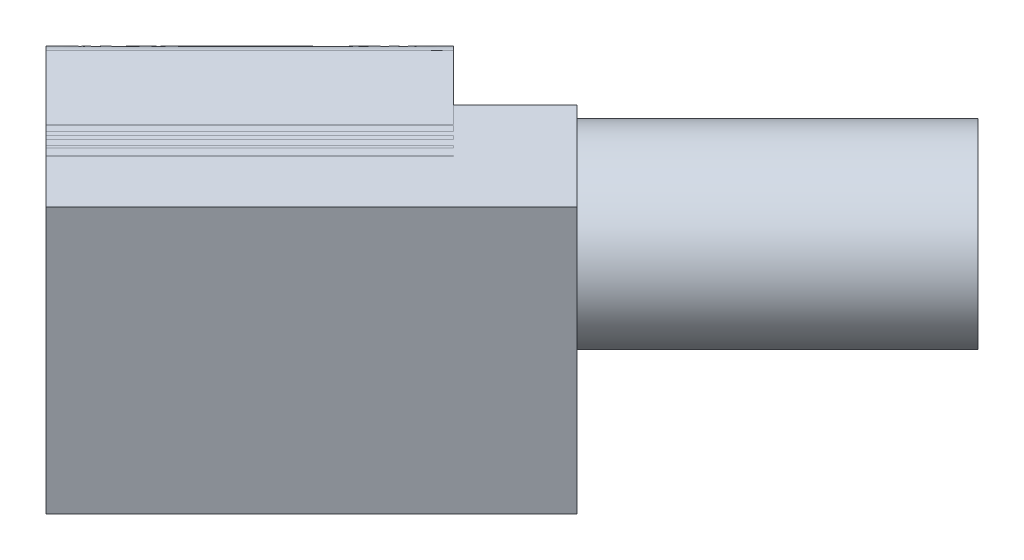
ISO-10303-21;
HEADER;
FILE_DESCRIPTION(('STEP AP214'),'2;1');
FILE_NAME('part.step','',(''),(''),'','','');
FILE_SCHEMA(('AUTOMOTIVE_DESIGN { 1 0 10303 214 1 1 1 1 }'));
ENDSEC;
DATA;
#1=APPLICATION_CONTEXT('core data for automotive mechanical design processes');
#2=APPLICATION_PROTOCOL_DEFINITION('international standard','automotive_design',2000,#1);
#3=PRODUCT_CONTEXT('',#1,'mechanical');
#4=PRODUCT('Part','Part','',(#3));
#5=PRODUCT_RELATED_PRODUCT_CATEGORY('part','',(#4));
#6=PRODUCT_DEFINITION_FORMATION('','',#4);
#7=PRODUCT_DEFINITION_CONTEXT('part definition',#1,'design');
#8=PRODUCT_DEFINITION('design','',#6,#7);
#9=PRODUCT_DEFINITION_SHAPE('','',#8);
#10=(LENGTH_UNIT() NAMED_UNIT(*) SI_UNIT(.MILLI.,.METRE.));
#11=(NAMED_UNIT(*) PLANE_ANGLE_UNIT() SI_UNIT($,.RADIAN.));
#12=(NAMED_UNIT(*) SI_UNIT($,.STERADIAN.) SOLID_ANGLE_UNIT());
#13=UNCERTAINTY_MEASURE_WITH_UNIT(LENGTH_MEASURE(1.E-05),#10,'distance_accuracy_value','');
#14=(GEOMETRIC_REPRESENTATION_CONTEXT(3) GLOBAL_UNCERTAINTY_ASSIGNED_CONTEXT((#13)) GLOBAL_UNIT_ASSIGNED_CONTEXT((#10,
#11,#12)) REPRESENTATION_CONTEXT('',''));
#15=CARTESIAN_POINT('',(0.,0.,0.));
#16=DIRECTION('',(0.,0.,1.));
#17=DIRECTION('',(1.,0.,0.));
#18=AXIS2_PLACEMENT_3D('',#15,#16,#17);
#19=CARTESIAN_POINT('',(-414.336279687479,104.516178530989,300.948076805882));
#20=CARTESIAN_POINT('',(-414.336515114687,104.800492867991,300.947841378674));
#21=CARTESIAN_POINT('',(-414.28633929126,105.08207851839,300.998017202102));
#22=CARTESIAN_POINT('',(-414.191163061049,105.332450282232,301.093193432313));
#23=B_SPLINE_CURVE_WITH_KNOTS('',3,(#19,#20,#21,#22),.UNSPECIFIED.,.F.,.F.,(4,4),(0.,
0.999999867875692),.UNSPECIFIED.);
#24=DIRECTION('',(-0.707106781186547,0.,0.707106781186548));
#25=VECTOR('',#24,1.);
#26=SURFACE_OF_LINEAR_EXTRUSION('',#23,#25);
#27=CARTESIAN_POINT('',(-442.145293223443,105.332450282232,329.047323594706));
#28=CARTESIAN_POINT('',(-442.240469453654,105.08207851839,328.952147364496));
#29=CARTESIAN_POINT('',(-442.290645277081,104.800492867991,328.901971541068));
#30=CARTESIAN_POINT('',(-442.290409849873,104.516178530989,328.902206968276));
#31=B_SPLINE_CURVE_WITH_KNOTS('',3,(#27,#28,#29,#30),.UNSPECIFIED.,.F.,.F.,(4,4),(0.,
0.999999867875692),.UNSPECIFIED.);
#32=CARTESIAN_POINT('',(-442.290409849873,104.516178530989,328.902206968276));
#33=VERTEX_POINT('',#32);
#34=CARTESIAN_POINT('',(-442.145294403479,105.332451050154,329.04732241467));
#35=VERTEX_POINT('',#34);
#36=EDGE_CURVE('E467',#33,#35,#31,.F.);
#37=ORIENTED_EDGE('',*,*,#36,.F.);
#38=DIRECTION('',(-0.707106781186547,0.,0.707106781186548));
#39=VECTOR('',#38,1.);
#40=CARTESIAN_POINT('',(-414.336279687479,104.516178530989,300.948076805882));
#41=LINE('',#40,#39);
#42=CARTESIAN_POINT('',(-414.336279687479,104.516178530989,300.948076805882));
#43=VERTEX_POINT('',#42);
#44=EDGE_CURVE('E73',#43,#33,#41,.T.);
#45=ORIENTED_EDGE('',*,*,#44,.F.);
#46=CARTESIAN_POINT('',(-414.336279687479,104.516178530989,300.948076805882));
#47=CARTESIAN_POINT('',(-414.336515114687,104.800492867991,300.947841378674));
#48=CARTESIAN_POINT('',(-414.28633929126,105.08207851839,300.998017202102));
#49=CARTESIAN_POINT('',(-414.191163061049,105.332450282232,301.093193432313));
#50=B_SPLINE_CURVE_WITH_KNOTS('',3,(#46,#47,#48,#49),.UNSPECIFIED.,.F.,.F.,(4,4),(0.,
0.999999867875692),.UNSPECIFIED.);
#51=CARTESIAN_POINT('',(-414.191164241085,105.332451050154,301.093192252276));
#52=VERTEX_POINT('',#51);
#53=EDGE_CURVE('E361',#43,#52,#50,.T.);
#54=ORIENTED_EDGE('',*,*,#53,.T.);
#55=DIRECTION('',(-0.707106781186547,0.,0.707106781186548));
#56=VECTOR('',#55,1.);
#57=CARTESIAN_POINT('',(-414.191164241085,105.332451050154,301.093192252276));
#58=LINE('',#57,#56);
#59=EDGE_CURVE('E133',#52,#35,#58,.T.);
#60=ORIENTED_EDGE('',*,*,#59,.T.);
#61=EDGE_LOOP('',(#37,#45,#54,#60));
#62=FACE_BOUND('',#61,.T.);
#63=ADVANCED_FACE('F53',(#62),#26,.T.);
#64=CARTESIAN_POINT('',(-414.336321316571,92.4707569212014,300.948035176791));
#65=DIRECTION('',(0.707106781178102,-4.88753552109326E-06,0.707106781178101));
#66=DIRECTION('',(0.707106781186547,0.,-0.707106781186548));
#67=AXIS2_PLACEMENT_3D('',#64,#65,#66);
#68=PLANE('',#67);
#69=DIRECTION('',(3.45600951220997E-06,0.999999999988056,3.45600950830037E-06));
#70=VECTOR('',#69,1.);
#71=CARTESIAN_POINT('',(-442.290451478964,92.4707569212014,328.902165339185));
#72=LINE('',#71,#70);
#73=CARTESIAN_POINT('',(-442.290451478964,92.4707569212014,328.902165339185));
#74=VERTEX_POINT('',#73);
#75=EDGE_CURVE('E455',#74,#33,#72,.T.);
#76=ORIENTED_EDGE('',*,*,#75,.F.);
#77=DIRECTION('',(-0.707106781186547,0.,0.707106781186548));
#78=VECTOR('',#77,1.);
#79=CARTESIAN_POINT('',(-414.336321316571,92.4707569212014,300.948035176791));
#80=LINE('',#79,#78);
#81=CARTESIAN_POINT('',(-414.336321316571,92.4707569212014,300.948035176791));
#82=VERTEX_POINT('',#81);
#83=EDGE_CURVE('E121',#82,#74,#80,.T.);
#84=ORIENTED_EDGE('',*,*,#83,.F.);
#85=DIRECTION('',(3.45600951220997E-06,0.999999999988056,3.45600950830037E-06));
#86=VECTOR('',#85,1.);
#87=CARTESIAN_POINT('',(-414.336321316571,92.4707569212014,300.948035176791));
#88=LINE('',#87,#86);
#89=EDGE_CURVE('E185',#82,#43,#88,.T.);
#90=ORIENTED_EDGE('',*,*,#89,.T.);
#91=ORIENTED_EDGE('',*,*,#44,.T.);
#92=EDGE_LOOP('',(#76,#84,#90,#91));
#93=FACE_BOUND('',#92,.T.);
#94=ADVANCED_FACE('F221',(#93),#68,.T.);
#95=CARTESIAN_POINT('',(-430.60634824251,92.470756921201,284.678008250852));
#96=DIRECTION('',(0.,-1.,0.));
#97=DIRECTION('',(0.,0.,-1.));
#98=AXIS2_PLACEMENT_3D('',#95,#96,#97);
#99=PLANE('',#98);
#100=DIRECTION('',(0.707106781186549,0.,0.707106781186547));
#101=VECTOR('',#100,1.);
#102=CARTESIAN_POINT('',(-458.560478404904,92.4707569212011,312.632138413245));
#103=LINE('',#102,#101);
#104=CARTESIAN_POINT('',(-458.560478404904,92.4707569212011,312.632138413245));
#105=VERTEX_POINT('',#104);
#106=EDGE_CURVE('E172',#105,#74,#103,.T.);
#107=ORIENTED_EDGE('',*,*,#106,.F.);
#108=DIRECTION('',(-0.707106781186547,0.,0.707106781186548));
#109=VECTOR('',#108,1.);
#110=CARTESIAN_POINT('',(-430.60634824251,92.470756921201,284.678008250852));
#111=LINE('',#110,#109);
#112=CARTESIAN_POINT('',(-430.60634824251,92.470756921201,284.678008250852));
#113=VERTEX_POINT('',#112);
#114=EDGE_CURVE('E167',#113,#105,#111,.T.);
#115=ORIENTED_EDGE('',*,*,#114,.F.);
#116=DIRECTION('',(0.707106781186549,0.,0.707106781186547));
#117=VECTOR('',#116,1.);
#118=CARTESIAN_POINT('',(-430.60634824251,92.470756921201,284.678008250852));
#119=LINE('',#118,#117);
#120=EDGE_CURVE('E170',#113,#82,#119,.T.);
#121=ORIENTED_EDGE('',*,*,#120,.T.);
#122=ORIENTED_EDGE('',*,*,#83,.T.);
#123=EDGE_LOOP('',(#107,#115,#121,#122));
#124=FACE_BOUND('',#123,.T.);
#125=ADVANCED_FACE('F169',(#124),#99,.T.);
#126=CARTESIAN_POINT('',(-430.606391468895,104.51522068189,284.677965024467));
#127=DIRECTION('',(-0.70710678117744,-5.07547212667677E-06,-0.70710678117744));
#128=DIRECTION('',(-0.707106781186547,0.,0.707106781186548));
#129=AXIS2_PLACEMENT_3D('',#126,#127,#128);
#130=PLANE('',#129);
#131=DIRECTION('',(3.58890075849645E-06,-0.99999999998712,3.58890075849645E-06));
#132=VECTOR('',#131,1.);
#133=CARTESIAN_POINT('',(-458.560521631289,104.51522068189,312.63209518686));
#134=LINE('',#133,#132);
#135=CARTESIAN_POINT('',(-458.560521631289,104.51522068189,312.63209518686));
#136=VERTEX_POINT('',#135);
#137=EDGE_CURVE('E532',#136,#105,#134,.T.);
#138=ORIENTED_EDGE('',*,*,#137,.F.);
#139=DIRECTION('',(-0.707106781186547,0.,0.707106781186548));
#140=VECTOR('',#139,1.);
#141=CARTESIAN_POINT('',(-430.606391468895,104.51522068189,284.677965024467));
#142=LINE('',#141,#140);
#143=CARTESIAN_POINT('',(-430.606391468895,104.51522068189,284.677965024467));
#144=VERTEX_POINT('',#143);
#145=EDGE_CURVE('E177',#144,#136,#142,.T.);
#146=ORIENTED_EDGE('',*,*,#145,.F.);
#147=DIRECTION('',(3.58890075849645E-06,-0.99999999998712,3.58890075849645E-06));
#148=VECTOR('',#147,1.);
#149=CARTESIAN_POINT('',(-430.606391468895,104.51522068189,284.677965024467));
#150=LINE('',#149,#148);
#151=EDGE_CURVE('E183',#144,#113,#150,.T.);
#152=ORIENTED_EDGE('',*,*,#151,.T.);
#153=ORIENTED_EDGE('',*,*,#114,.T.);
#154=EDGE_LOOP('',(#138,#146,#152,#153));
#155=FACE_BOUND('',#154,.T.);
#156=ADVANCED_FACE('F187',(#155),#130,.T.);
#157=CARTESIAN_POINT('',(-430.751186217312,105.331611216889,284.53317027605));
#158=CARTESIAN_POINT('',(-430.655996702823,105.081184567548,284.628359790538));
#159=CARTESIAN_POINT('',(-430.60614980153,104.799480611385,284.678206691832));
#160=CARTESIAN_POINT('',(-430.606391886055,104.5152206058,284.677964607306));
#161=B_SPLINE_CURVE_WITH_KNOTS('',3,(#157,#158,#159,#160),.UNSPECIFIED.,.F.,.F.,(4,4),(0.,
0.999999909930679),.UNSPECIFIED.);
#162=DIRECTION('',(-0.707106781186547,0.,0.707106781186548));
#163=VECTOR('',#162,1.);
#164=SURFACE_OF_LINEAR_EXTRUSION('',#161,#163);
#165=CARTESIAN_POINT('',(-458.560522048449,104.5152206058,312.6320947697));
#166=CARTESIAN_POINT('',(-458.560279963924,104.799480611385,312.632336854225));
#167=CARTESIAN_POINT('',(-458.610126865217,105.081184567548,312.582489952932));
#168=CARTESIAN_POINT('',(-458.705316379706,105.331611216889,312.487300438443));
#169=B_SPLINE_CURVE_WITH_KNOTS('',3,(#165,#166,#167,#168),.UNSPECIFIED.,.F.,.F.,(4,4),(0.,
0.999999909930679),.UNSPECIFIED.);
#170=CARTESIAN_POINT('',(-458.705316379706,105.331611216889,312.487300438443));
#171=VERTEX_POINT('',#170);
#172=EDGE_CURVE('E202',#171,#136,#169,.F.);
#173=ORIENTED_EDGE('',*,*,#172,.F.);
#174=DIRECTION('',(-0.707106781186547,0.,0.707106781186548));
#175=VECTOR('',#174,1.);
#176=CARTESIAN_POINT('',(-430.751186217312,105.331611216889,284.53317027605));
#177=LINE('',#176,#175);
#178=CARTESIAN_POINT('',(-430.751186217312,105.331611216889,284.53317027605));
#179=VERTEX_POINT('',#178);
#180=EDGE_CURVE('E608',#179,#171,#177,.T.);
#181=ORIENTED_EDGE('',*,*,#180,.F.);
#182=CARTESIAN_POINT('',(-430.751186217312,105.331611216889,284.53317027605));
#183=CARTESIAN_POINT('',(-430.655996702823,105.081184567548,284.628359790538));
#184=CARTESIAN_POINT('',(-430.60614980153,104.799480611385,284.678206691832));
#185=CARTESIAN_POINT('',(-430.606391886055,104.5152206058,284.677964607306));
#186=B_SPLINE_CURVE_WITH_KNOTS('',3,(#182,#183,#184,#185),.UNSPECIFIED.,.F.,.F.,(4,4),(0.,
0.999999909930679),.UNSPECIFIED.);
#187=EDGE_CURVE('E188',#179,#144,#186,.T.);
#188=ORIENTED_EDGE('',*,*,#187,.T.);
#189=ORIENTED_EDGE('',*,*,#145,.T.);
#190=EDGE_LOOP('',(#173,#181,#188,#189));
#191=FACE_BOUND('',#190,.T.);
#192=ADVANCED_FACE('F545',(#191),#164,.T.);
#193=CARTESIAN_POINT('',(-422.471334797785,111.609532937302,292.813021695577));
#194=DIRECTION('',(-0.707106781186547,0.,0.707106781186548));
#195=DIRECTION('',(0.707106781186548,0.,0.707106781186547));
#196=AXIS2_PLACEMENT_3D('',#193,#194,#195);
#197=CYLINDRICAL_SURFACE('',#196,13.2862412259459);
#198=CARTESIAN_POINT('',(-450.425464960179,111.609532937302,320.76715185797));
#199=DIRECTION('',(-0.707106781186547,0.,0.707106781186548));
#200=DIRECTION('',(0.707106781186548,0.,0.707106781186547));
#201=AXIS2_PLACEMENT_3D('',#198,#199,#200);
#202=CIRCLE('',#201,13.2862412259459);
#203=CARTESIAN_POINT('',(-458.705635516878,117.886614824449,312.486981301271));
#204=VERTEX_POINT('',#203);
#205=EDGE_CURVE('E442',#204,#171,#202,.T.);
#206=ORIENTED_EDGE('',*,*,#205,.F.);
#207=DIRECTION('',(-0.707106781186547,0.,0.707106781186548));
#208=VECTOR('',#207,1.);
#209=CARTESIAN_POINT('',(-430.751505354484,117.886614824449,284.532851138877));
#210=LINE('',#209,#208);
#211=CARTESIAN_POINT('',(-430.751505354484,117.886614824449,284.532851138877));
#212=VERTEX_POINT('',#211);
#213=EDGE_CURVE('E601',#212,#204,#210,.T.);
#214=ORIENTED_EDGE('',*,*,#213,.F.);
#215=CARTESIAN_POINT('',(-422.471334797785,111.609532937302,292.813021695577));
#216=DIRECTION('',(-0.707106781186547,0.,0.707106781186548));
#217=DIRECTION('',(0.707106781186548,0.,0.707106781186547));
#218=AXIS2_PLACEMENT_3D('',#215,#216,#217);
#219=CIRCLE('',#218,13.2862412259459);
#220=EDGE_CURVE('E190',#212,#179,#219,.T.);
#221=ORIENTED_EDGE('',*,*,#220,.T.);
#222=ORIENTED_EDGE('',*,*,#180,.T.);
#223=EDGE_LOOP('',(#206,#214,#221,#222));
#224=FACE_BOUND('',#223,.T.);
#225=ADVANCED_FACE('F555',(#224),#197,.T.);
#226=CARTESIAN_POINT('',(-430.60638990809,118.702887343615,284.677966585271));
#227=CARTESIAN_POINT('',(-430.606154480882,118.418573006612,284.678202012479));
#228=CARTESIAN_POINT('',(-430.65633030431,118.136987356214,284.628026189052));
#229=CARTESIAN_POINT('',(-430.751506534521,117.886615592371,284.532849958841));
#230=B_SPLINE_CURVE_WITH_KNOTS('',3,(#226,#227,#228,#229),.UNSPECIFIED.,.F.,.F.,(4,4),(0.,
0.999999867896139),.UNSPECIFIED.);
#231=DIRECTION('',(-0.707106781186547,0.,0.707106781186548));
#232=VECTOR('',#231,1.);
#233=SURFACE_OF_LINEAR_EXTRUSION('',#230,#232);
#234=CARTESIAN_POINT('',(-458.705636696914,117.886615592371,312.486980121235));
#235=CARTESIAN_POINT('',(-458.610460466703,118.136987356214,312.582156351446));
#236=CARTESIAN_POINT('',(-458.560284643276,118.418573006612,312.632332174873));
#237=CARTESIAN_POINT('',(-458.560520070484,118.702887343615,312.632096747665));
#238=B_SPLINE_CURVE_WITH_KNOTS('',3,(#234,#235,#236,#237),.UNSPECIFIED.,.F.,.F.,(4,4),(0.,
0.999999867896139),.UNSPECIFIED.);
#239=CARTESIAN_POINT('',(-458.560520070484,118.702887343615,312.632096747665));
#240=VERTEX_POINT('',#239);
#241=EDGE_CURVE('E439',#240,#204,#238,.F.);
#242=ORIENTED_EDGE('',*,*,#241,.F.);
#243=DIRECTION('',(-0.707106781186547,0.,0.707106781186548));
#244=VECTOR('',#243,1.);
#245=CARTESIAN_POINT('',(-430.60638990809,118.702887343615,284.677966585271));
#246=LINE('',#245,#244);
#247=CARTESIAN_POINT('',(-430.60638990809,118.702887343615,284.677966585271));
#248=VERTEX_POINT('',#247);
#249=EDGE_CURVE('E420',#248,#240,#246,.T.);
#250=ORIENTED_EDGE('',*,*,#249,.F.);
#251=CARTESIAN_POINT('',(-430.60638990809,118.702887343615,284.677966585271));
#252=CARTESIAN_POINT('',(-430.606154480882,118.418573006612,284.678202012479));
#253=CARTESIAN_POINT('',(-430.65633030431,118.136987356214,284.628026189052));
#254=CARTESIAN_POINT('',(-430.751506534521,117.886615592371,284.532849958841));
#255=B_SPLINE_CURVE_WITH_KNOTS('',3,(#251,#252,#253,#254),.UNSPECIFIED.,.F.,.F.,(4,4),(0.,
0.999999867896139),.UNSPECIFIED.);
#256=EDGE_CURVE('E590',#248,#212,#255,.T.);
#257=ORIENTED_EDGE('',*,*,#256,.T.);
#258=ORIENTED_EDGE('',*,*,#213,.T.);
#259=EDGE_LOOP('',(#242,#250,#257,#258));
#260=FACE_BOUND('',#259,.T.);
#261=ADVANCED_FACE('F569',(#260),#233,.T.);
#262=CARTESIAN_POINT('',(-430.606387960258,124.590893270906,284.677968533104));
#263=DIRECTION('',(-0.707106781186471,4.67841085878113E-07,-0.70710678118647));
#264=DIRECTION('',(-0.707106781186547,0.,0.707106781186548));
#265=AXIS2_PLACEMENT_3D('',#262,#263,#264);
#266=PLANE('',#265);
#267=DIRECTION('',(0.707106781186547,1.17128107399017E-13,-0.707106781186548));
#268=VECTOR('',#267,1.);
#269=CARTESIAN_POINT('',(-430.606388508557,122.933466311513,284.677967984804));
#270=LINE('',#269,#268);
#271=CARTESIAN_POINT('',(-458.560518670952,122.933466311508,312.632098147199));
#272=VERTEX_POINT('',#271);
#273=CARTESIAN_POINT('',(-449.368130962125,122.93346631151,303.439709545176));
#274=VERTEX_POINT('',#273);
#275=EDGE_CURVE('E438',#272,#274,#270,.T.);
#276=ORIENTED_EDGE('',*,*,#275,.F.);
#277=DIRECTION('',(-3.30813604342092E-07,-0.999999999999891,-3.30813604342092E-07));
#278=VECTOR('',#277,1.);
#279=CARTESIAN_POINT('',(-458.560518122652,124.590893270906,312.632098695497));
#280=LINE('',#279,#278);
#281=CARTESIAN_POINT('',(-458.560518122652,124.590893270906,312.632098695497));
#282=VERTEX_POINT('',#281);
#283=EDGE_CURVE('E426',#282,#272,#280,.T.);
#284=ORIENTED_EDGE('',*,*,#283,.F.);
#285=DIRECTION('',(-0.707106781186547,0.,0.707106781186548));
#286=VECTOR('',#285,1.);
#287=CARTESIAN_POINT('',(-430.606387960258,124.590893270906,284.677968533104));
#288=LINE('',#287,#286);
#289=CARTESIAN_POINT('',(-430.606387960258,124.590893270906,284.677968533104));
#290=VERTEX_POINT('',#289);
#291=EDGE_CURVE('E418',#290,#282,#288,.T.);
#292=ORIENTED_EDGE('',*,*,#291,.F.);
#293=DIRECTION('',(-3.30813604342092E-07,-0.999999999999891,-3.30813604342092E-07));
#294=VECTOR('',#293,1.);
#295=CARTESIAN_POINT('',(-430.606387960258,124.590893270906,284.677968533104));
#296=LINE('',#295,#294);
#297=EDGE_CURVE('E411',#290,#248,#296,.T.);
#298=ORIENTED_EDGE('',*,*,#297,.T.);
#299=ORIENTED_EDGE('',*,*,#249,.T.);
#300=CARTESIAN_POINT('',(-458.560519729555,119.733466311508,312.632097088595));
#301=VERTEX_POINT('',#300);
#302=EDGE_CURVE('E396',#301,#240,#280,.T.);
#303=ORIENTED_EDGE('',*,*,#302,.F.);
#304=DIRECTION('',(-0.707106781186547,-1.16359913157828E-13,0.707106781186548));
#305=VECTOR('',#304,1.);
#306=CARTESIAN_POINT('',(-430.60638956716,119.733466311513,284.6779669262));
#307=LINE('',#306,#305);
#308=CARTESIAN_POINT('',(-449.36813157413,119.73346631151,303.43970893317));
#309=VERTEX_POINT('',#308);
#310=EDGE_CURVE('E510',#309,#301,#307,.T.);
#311=ORIENTED_EDGE('',*,*,#310,.F.);
#312=DIRECTION('',(3.30813521520011E-07,0.999999999999891,3.30813687164173E-07));
#313=VECTOR('',#312,1.);
#314=CARTESIAN_POINT('',(-449.368129967228,124.590893270903,303.439710540074));
#315=LINE('',#314,#313);
#316=EDGE_CURVE('E506',#309,#274,#315,.T.);
#317=ORIENTED_EDGE('',*,*,#316,.T.);
#318=EDGE_LOOP('',(#276,#284,#292,#298,#299,#303,#311,#317));
#319=FACE_BOUND('',#318,.T.);
#320=ADVANCED_FACE('F435',(#319),#266,.T.);
#321=CARTESIAN_POINT('',(-428.948243495614,126.931812454713,286.336112997747));
#322=CARTESIAN_POINT('',(-429.167013336018,126.931600039083,286.117343157344));
#323=CARTESIAN_POINT('',(-429.381917330875,126.872071869421,285.902439162486));
#324=CARTESIAN_POINT('',(-429.783318438389,126.637562427135,285.501038054973));
#325=CARTESIAN_POINT('',(-429.967193185959,126.463966036742,285.317163307402));
#326=CARTESIAN_POINT('',(-430.426283244311,125.816673430639,284.85807324905));
#327=CARTESIAN_POINT('',(-430.606585132333,125.209920549053,284.677771361029));
#328=CARTESIAN_POINT('',(-430.606385554328,124.590893272506,284.677970939034));
#329=B_SPLINE_CURVE_WITH_KNOTS('',3,(#321,#322,#323,#324,#325,#326,#327,#328),.UNSPECIFIED.,.F.,
.F.,(4,2,2,4),(0.,0.250000000000005,0.50000000000001,1.),.UNSPECIFIED.);
#330=DIRECTION('',(-0.707106781186547,0.,0.707106781186548));
#331=VECTOR('',#330,1.);
#332=SURFACE_OF_LINEAR_EXTRUSION('',#329,#331);
#333=CARTESIAN_POINT('',(-458.560515716721,124.590893272506,312.632101101428));
#334=CARTESIAN_POINT('',(-458.560715294726,125.209920549053,312.631901523422));
#335=CARTESIAN_POINT('',(-458.380413406705,125.816673430639,312.812203411444));
#336=CARTESIAN_POINT('',(-457.921323348353,126.463966036742,313.271293469796));
#337=CARTESIAN_POINT('',(-457.737448600782,126.637562427135,313.455168217366));
#338=CARTESIAN_POINT('',(-457.336047493269,126.872071869421,313.85656932488));
#339=CARTESIAN_POINT('',(-457.121143498412,126.931600039083,314.071473319737));
#340=CARTESIAN_POINT('',(-456.902373658008,126.931812454713,314.290243160141));
#341=B_SPLINE_CURVE_WITH_KNOTS('',3,(#333,#334,#335,#336,#337,#338,#339,#340),.UNSPECIFIED.,.F.,
.F.,(4,2,2,4),(0.,0.49999999999999,0.749999999999995,1.),.UNSPECIFIED.);
#342=CARTESIAN_POINT('',(-456.902373658008,126.931812454713,314.290243160141));
#343=VERTEX_POINT('',#342);
#344=EDGE_CURVE('E394',#343,#282,#341,.F.);
#345=ORIENTED_EDGE('',*,*,#344,.F.);
#346=DIRECTION('',(-0.707106781186547,0.,0.707106781186548));
#347=VECTOR('',#346,1.);
#348=CARTESIAN_POINT('',(-428.948243495614,126.931812454713,286.336112997747));
#349=LINE('',#348,#347);
#350=CARTESIAN_POINT('',(-428.948243495614,126.931812454713,286.336112997747));
#351=VERTEX_POINT('',#350);
#352=EDGE_CURVE('E373',#351,#343,#349,.T.);
#353=ORIENTED_EDGE('',*,*,#352,.F.);
#354=CARTESIAN_POINT('',(-428.948243495614,126.931812454713,286.336112997747));
#355=CARTESIAN_POINT('',(-429.167013336018,126.931600039083,286.117343157344));
#356=CARTESIAN_POINT('',(-429.381917330875,126.872071869421,285.902439162486));
#357=CARTESIAN_POINT('',(-429.783318438389,126.637562427135,285.501038054973));
#358=CARTESIAN_POINT('',(-429.967193185959,126.463966036742,285.317163307402));
#359=CARTESIAN_POINT('',(-430.426283244311,125.816673430639,284.85807324905));
#360=CARTESIAN_POINT('',(-430.606585132333,125.209920549053,284.677771361029));
#361=CARTESIAN_POINT('',(-430.606385554328,124.590893272506,284.677970939034));
#362=B_SPLINE_CURVE_WITH_KNOTS('',3,(#354,#355,#356,#357,#358,#359,#360,#361),.UNSPECIFIED.,.F.,
.F.,(4,2,2,4),(0.,0.250000000000005,0.50000000000001,1.),.UNSPECIFIED.);
#363=EDGE_CURVE('E407',#351,#290,#362,.T.);
#364=ORIENTED_EDGE('',*,*,#363,.T.);
#365=ORIENTED_EDGE('',*,*,#291,.T.);
#366=EDGE_LOOP('',(#345,#353,#364,#365));
#367=FACE_BOUND('',#366,.T.);
#368=ADVANCED_FACE('F428',(#367),#332,.T.);
#369=CARTESIAN_POINT('',(-415.991560419414,126.931811073185,299.292796073947));
#370=DIRECTION('',(5.33133390608757E-08,0.999999999999997,5.33133380839417E-08));
#371=DIRECTION('',(-0.999999999999999,5.33133390608758E-08,0.));
#372=AXIS2_PLACEMENT_3D('',#369,#370,#371);
#373=PLANE('',#372);
#374=DIRECTION('',(-0.707106781186544,7.53964464644891E-08,-0.707106781186547));
#375=VECTOR('',#374,1.);
#376=CARTESIAN_POINT('',(-443.945690581808,126.931811073185,327.246926236341));
#377=LINE('',#376,#375);
#378=CARTESIAN_POINT('',(-443.945690581808,126.931811073185,327.246926236341));
#379=VERTEX_POINT('',#378);
#380=EDGE_CURVE('E392',#379,#343,#377,.T.);
#381=ORIENTED_EDGE('',*,*,#380,.F.);
#382=DIRECTION('',(-0.707106781186547,0.,0.707106781186548));
#383=VECTOR('',#382,1.);
#384=CARTESIAN_POINT('',(-415.991560419414,126.931811073185,299.292796073947));
#385=LINE('',#384,#383);
#386=CARTESIAN_POINT('',(-415.991560419414,126.931811073185,299.292796073947));
#387=VERTEX_POINT('',#386);
#388=EDGE_CURVE('E368',#387,#379,#385,.T.);
#389=ORIENTED_EDGE('',*,*,#388,.F.);
#390=DIRECTION('',(-0.707106781186544,7.53964464644891E-08,-0.707106781186547));
#391=VECTOR('',#390,1.);
#392=CARTESIAN_POINT('',(-415.991560419414,126.931811073185,299.292796073947));
#393=LINE('',#392,#391);
#394=EDGE_CURVE('E405',#387,#351,#393,.T.);
#395=ORIENTED_EDGE('',*,*,#394,.T.);
#396=ORIENTED_EDGE('',*,*,#352,.T.);
#397=EDGE_LOOP('',(#381,#389,#395,#396));
#398=FACE_BOUND('',#397,.T.);
#399=ADVANCED_FACE('F308',(#398),#373,.T.);
#400=CARTESIAN_POINT('',(-414.336281057963,124.588570288252,300.948075435399));
#401=CARTESIAN_POINT('',(-414.33643120429,124.89784591621,300.947925289072));
#402=CARTESIAN_POINT('',(-414.378806724845,125.201572162846,300.905549768516));
#403=CARTESIAN_POINT('',(-414.544772135289,125.768815773084,300.739584358073));
#404=CARTESIAN_POINT('',(-414.667562891787,126.028677898947,300.616793601574));
#405=CARTESIAN_POINT('',(-415.125199742174,126.677335876206,300.159156751187));
#406=CARTESIAN_POINT('',(-415.554053806641,126.932089161991,299.73030268672));
#407=CARTESIAN_POINT('',(-415.991560418081,126.931807047558,299.292796075281));
#408=B_SPLINE_CURVE_WITH_KNOTS('',3,(#400,#401,#402,#403,#404,#405,#406,#407),.UNSPECIFIED.,.F.,
.F.,(4,2,2,4),(0.,0.249999999999998,0.499999999999997,1.),.UNSPECIFIED.);
#409=DIRECTION('',(-0.707106781186547,0.,0.707106781186548));
#410=VECTOR('',#409,1.);
#411=SURFACE_OF_LINEAR_EXTRUSION('',#408,#410);
#412=CARTESIAN_POINT('',(-443.945690580474,126.931807047558,327.246926237674));
#413=CARTESIAN_POINT('',(-443.508183969035,126.932089161992,327.684432849114));
#414=CARTESIAN_POINT('',(-443.079329904568,126.677335876206,328.113286913581));
#415=CARTESIAN_POINT('',(-442.621693054181,126.028677898947,328.570923763968));
#416=CARTESIAN_POINT('',(-442.498902297682,125.768815773085,328.693714520466));
#417=CARTESIAN_POINT('',(-442.332936887239,125.201572162846,328.85967993091));
#418=CARTESIAN_POINT('',(-442.290561366683,124.89784591621,328.902055451466));
#419=CARTESIAN_POINT('',(-442.290411220356,124.588570288252,328.902205597793));
#420=B_SPLINE_CURVE_WITH_KNOTS('',3,(#412,#413,#414,#415,#416,#417,#418,#419),.UNSPECIFIED.,.F.,
.F.,(4,2,2,4),(0.,0.500000000000003,0.750000000000002,1.),.UNSPECIFIED.);
#421=CARTESIAN_POINT('',(-442.290411220356,124.588570288252,328.902205597793));
#422=VERTEX_POINT('',#421);
#423=EDGE_CURVE('E329',#422,#379,#420,.F.);
#424=ORIENTED_EDGE('',*,*,#423,.F.);
#425=DIRECTION('',(-0.707106781186547,0.,0.707106781186548));
#426=VECTOR('',#425,1.);
#427=CARTESIAN_POINT('',(-414.336281057963,124.588570288252,300.948075435399));
#428=LINE('',#427,#426);
#429=CARTESIAN_POINT('',(-414.336281057963,124.588570288252,300.948075435399));
#430=VERTEX_POINT('',#429);
#431=EDGE_CURVE('E364',#430,#422,#428,.T.);
#432=ORIENTED_EDGE('',*,*,#431,.F.);
#433=CARTESIAN_POINT('',(-414.336281057963,124.588570288252,300.948075435399));
#434=CARTESIAN_POINT('',(-414.33643120429,124.89784591621,300.947925289072));
#435=CARTESIAN_POINT('',(-414.378806724845,125.201572162846,300.905549768516));
#436=CARTESIAN_POINT('',(-414.544772135289,125.768815773084,300.739584358073));
#437=CARTESIAN_POINT('',(-414.667562891787,126.028677898947,300.616793601574));
#438=CARTESIAN_POINT('',(-415.125199742174,126.677335876206,300.159156751187));
#439=CARTESIAN_POINT('',(-415.554053806641,126.932089161991,299.73030268672));
#440=CARTESIAN_POINT('',(-415.991560418081,126.931807047558,299.292796075281));
#441=B_SPLINE_CURVE_WITH_KNOTS('',3,(#433,#434,#435,#436,#437,#438,#439,#440),.UNSPECIFIED.,.F.,
.F.,(4,2,2,4),(0.,0.249999999999998,0.499999999999997,1.),.UNSPECIFIED.);
#442=EDGE_CURVE('E383',#430,#387,#441,.T.);
#443=ORIENTED_EDGE('',*,*,#442,.T.);
#444=ORIENTED_EDGE('',*,*,#388,.T.);
#445=EDGE_LOOP('',(#424,#432,#443,#444));
#446=FACE_BOUND('',#445,.T.);
#447=ADVANCED_FACE('F304',(#446),#411,.T.);
#448=CARTESIAN_POINT('',(-414.336278126667,118.7038416328,300.948078366694));
#449=DIRECTION('',(0.707106781186372,7.0444663402036E-07,0.707106781186372));
#450=DIRECTION('',(0.707106781186547,0.,-0.707106781186548));
#451=AXIS2_PLACEMENT_3D('',#448,#449,#450);
#452=PLANE('',#451);
#453=DIRECTION('',(-0.707106781186547,-1.17128107399017E-13,0.707106781186548));
#454=VECTOR('',#453,1.);
#455=CARTESIAN_POINT('',(-414.336280233524,122.933466311516,300.948076259838));
#456=LINE('',#455,#454);
#457=CARTESIAN_POINT('',(-433.098021568033,122.933466311512,319.709818939268));
#458=VERTEX_POINT('',#457);
#459=CARTESIAN_POINT('',(-442.290410395919,122.933466311511,328.902206422233));
#460=VERTEX_POINT('',#459);
#461=EDGE_CURVE('E907',#458,#460,#456,.T.);
#462=ORIENTED_EDGE('',*,*,#461,.F.);
#463=DIRECTION('',(4.98119074721911E-07,-0.999999999999752,4.98118909077759E-07));
#464=VECTOR('',#463,1.);
#465=CARTESIAN_POINT('',(-433.098020133637,118.703841632797,319.709820373664));
#466=LINE('',#465,#464);
#467=CARTESIAN_POINT('',(-433.098020646513,119.733466311512,319.709819860788));
#468=VERTEX_POINT('',#467);
#469=EDGE_CURVE('E12',#458,#468,#466,.T.);
#470=ORIENTED_EDGE('',*,*,#469,.T.);
#471=DIRECTION('',(0.707106781186547,1.16359913157828E-13,-0.707106781186548));
#472=VECTOR('',#471,1.);
#473=CARTESIAN_POINT('',(-414.336278639543,119.733466311516,300.948077853819));
#474=LINE('',#473,#472);
#475=CARTESIAN_POINT('',(-442.290408801938,119.733466311511,328.902208016213));
#476=VERTEX_POINT('',#475);
#477=EDGE_CURVE('E930',#476,#468,#474,.T.);
#478=ORIENTED_EDGE('',*,*,#477,.F.);
#479=DIRECTION('',(-4.98118995901114E-07,0.999999999999752,-4.98118987898556E-07));
#480=VECTOR('',#479,1.);
#481=CARTESIAN_POINT('',(-442.290408289061,118.7038416328,328.902208529088));
#482=LINE('',#481,#480);
#483=CARTESIAN_POINT('',(-442.290408289061,118.7038416328,328.902208529088));
#484=VERTEX_POINT('',#483);
#485=EDGE_CURVE('E322',#484,#476,#482,.T.);
#486=ORIENTED_EDGE('',*,*,#485,.F.);
#487=DIRECTION('',(-0.707106781186547,0.,0.707106781186548));
#488=VECTOR('',#487,1.);
#489=CARTESIAN_POINT('',(-414.336278126667,118.7038416328,300.948078366694));
#490=LINE('',#489,#488);
#491=CARTESIAN_POINT('',(-414.336278126667,118.7038416328,300.948078366694));
#492=VERTEX_POINT('',#491);
#493=EDGE_CURVE('E356',#492,#484,#490,.T.);
#494=ORIENTED_EDGE('',*,*,#493,.F.);
#495=DIRECTION('',(-4.98118995901114E-07,0.999999999999752,-4.98118987898556E-07));
#496=VECTOR('',#495,1.);
#497=CARTESIAN_POINT('',(-414.336278126667,118.7038416328,300.948078366694));
#498=LINE('',#497,#496);
#499=EDGE_CURVE('E381',#492,#430,#498,.T.);
#500=ORIENTED_EDGE('',*,*,#499,.T.);
#501=ORIENTED_EDGE('',*,*,#431,.T.);
#502=EDGE_CURVE('E58',#460,#422,#482,.T.);
#503=ORIENTED_EDGE('',*,*,#502,.F.);
#504=EDGE_LOOP('',(#462,#470,#478,#486,#494,#500,#501,#503));
#505=FACE_BOUND('',#504,.T.);
#506=ADVANCED_FACE('F278',(#505),#452,.T.);
#507=CARTESIAN_POINT('',(-414.191483378258,117.887454657714,301.092873115104));
#508=CARTESIAN_POINT('',(-414.286672491741,118.137880252082,300.99768400162));
#509=CARTESIAN_POINT('',(-414.336519796079,118.41958286107,300.947836697282));
#510=CARTESIAN_POINT('',(-414.336277712547,118.703841708337,300.948078780815));
#511=B_SPLINE_CURVE_WITH_KNOTS('',3,(#507,#508,#509,#510),.UNSPECIFIED.,.F.,.F.,(4,4),(0.,
0.999999910707361),.UNSPECIFIED.);
#512=DIRECTION('',(-0.707106781186547,0.,0.707106781186548));
#513=VECTOR('',#512,1.);
#514=SURFACE_OF_LINEAR_EXTRUSION('',#511,#513);
#515=CARTESIAN_POINT('',(-442.29040787494,118.703841708337,328.902208943209));
#516=CARTESIAN_POINT('',(-442.290649958473,118.41958286107,328.901966859676));
#517=CARTESIAN_POINT('',(-442.240802654135,118.137880252082,328.951814164014));
#518=CARTESIAN_POINT('',(-442.145613540652,117.887454657714,329.047003277497));
#519=B_SPLINE_CURVE_WITH_KNOTS('',3,(#515,#516,#517,#518),.UNSPECIFIED.,.F.,.F.,(4,4),(0.,
0.999999910707361),.UNSPECIFIED.);
#520=CARTESIAN_POINT('',(-442.145613540652,117.887454657714,329.047003277497));
#521=VERTEX_POINT('',#520);
#522=EDGE_CURVE('E259',#521,#484,#519,.F.);
#523=ORIENTED_EDGE('',*,*,#522,.F.);
#524=DIRECTION('',(-0.707106781186547,0.,0.707106781186548));
#525=VECTOR('',#524,1.);
#526=CARTESIAN_POINT('',(-414.191483378258,117.887454657714,301.092873115104));
#527=LINE('',#526,#525);
#528=CARTESIAN_POINT('',(-414.191483378258,117.887454657714,301.092873115104));
#529=VERTEX_POINT('',#528);
#530=EDGE_CURVE('E349',#529,#521,#527,.T.);
#531=ORIENTED_EDGE('',*,*,#530,.F.);
#532=CARTESIAN_POINT('',(-414.191483378258,117.887454657714,301.092873115104));
#533=CARTESIAN_POINT('',(-414.286672491741,118.137880252082,300.99768400162));
#534=CARTESIAN_POINT('',(-414.336519796079,118.41958286107,300.947836697282));
#535=CARTESIAN_POINT('',(-414.336277712547,118.703841708337,300.948078780815));
#536=B_SPLINE_CURVE_WITH_KNOTS('',3,(#532,#533,#534,#535),.UNSPECIFIED.,.F.,.F.,(4,4),(0.,
0.999999910707361),.UNSPECIFIED.);
#537=EDGE_CURVE('E335',#529,#492,#536,.T.);
#538=ORIENTED_EDGE('',*,*,#537,.T.);
#539=ORIENTED_EDGE('',*,*,#493,.T.);
#540=EDGE_LOOP('',(#523,#531,#538,#539));
#541=FACE_BOUND('',#540,.T.);
#542=ADVANCED_FACE('F267',(#541),#514,.T.);
#543=CARTESIAN_POINT('',(-422.471334797785,111.609532937302,292.813021695577));
#544=DIRECTION('',(-0.707106781186547,0.,0.707106781186548));
#545=DIRECTION('',(0.707106781186548,0.,0.707106781186547));
#546=AXIS2_PLACEMENT_3D('',#543,#544,#545);
#547=CYLINDRICAL_SURFACE('',#546,13.2862412259458);
#548=CARTESIAN_POINT('',(-450.425464960179,111.609532937302,320.76715185797));
#549=DIRECTION('',(-0.707106781186547,0.,0.707106781186548));
#550=DIRECTION('',(0.707106781186548,0.,0.707106781186547));
#551=AXIS2_PLACEMENT_3D('',#548,#549,#550);
#552=CIRCLE('',#551,13.2862412259458);
#553=EDGE_CURVE('E265',#35,#521,#552,.T.);
#554=ORIENTED_EDGE('',*,*,#553,.F.);
#555=ORIENTED_EDGE('',*,*,#59,.F.);
#556=CARTESIAN_POINT('',(-422.471334797785,111.609532937302,292.813021695577));
#557=DIRECTION('',(-0.707106781186547,0.,0.707106781186548));
#558=DIRECTION('',(0.707106781186548,0.,0.707106781186547));
#559=AXIS2_PLACEMENT_3D('',#556,#557,#558);
#560=CIRCLE('',#559,13.2862412259458);
#561=EDGE_CURVE('E359',#52,#529,#560,.T.);
#562=ORIENTED_EDGE('',*,*,#561,.T.);
#563=ORIENTED_EDGE('',*,*,#530,.T.);
#564=EDGE_LOOP('',(#554,#555,#562,#563));
#565=FACE_BOUND('',#564,.T.);
#566=ADVANCED_FACE('F277',(#565),#547,.T.);
#567=CARTESIAN_POINT('',(-414.299500745796,104.937042871546,300.984855747565));
#568=DIRECTION('',(-0.707106781186551,-1.17128107399017E-13,0.707106781186544));
#569=DIRECTION('',(0.707106781186544,0.,0.707106781186551));
#570=AXIS2_PLACEMENT_3D('',#567,#568,#569);
#571=PLANE('',#570);
#572=CARTESIAN_POINT('',(-422.471334797786,111.609532937274,292.813021695576));
#573=DIRECTION('',(0.707106781186551,1.17128107399017E-13,-0.707106781186544));
#574=DIRECTION('',(-0.707106781186544,0.,-0.707106781186551));
#575=AXIS2_PLACEMENT_3D('',#572,#573,#574);
#576=CIRCLE('',#575,11.19822);
#577=CARTESIAN_POINT('',(-430.389672097005,111.609532937274,284.894684396357));
#578=VERTEX_POINT('',#577);
#579=EDGE_CURVE('E65',#578,#578,#576,.T.);
#580=ORIENTED_EDGE('',*,*,#579,.F.);
#581=EDGE_LOOP('',(#580));
#582=FACE_BOUND('',#581,.T.);
#583=ORIENTED_EDGE('',*,*,#53,.F.);
#584=ORIENTED_EDGE('',*,*,#89,.F.);
#585=ORIENTED_EDGE('',*,*,#120,.F.);
#586=ORIENTED_EDGE('',*,*,#151,.F.);
#587=ORIENTED_EDGE('',*,*,#187,.F.);
#588=ORIENTED_EDGE('',*,*,#220,.F.);
#589=ORIENTED_EDGE('',*,*,#256,.F.);
#590=ORIENTED_EDGE('',*,*,#297,.F.);
#591=ORIENTED_EDGE('',*,*,#363,.F.);
#592=ORIENTED_EDGE('',*,*,#394,.F.);
#593=ORIENTED_EDGE('',*,*,#442,.F.);
#594=ORIENTED_EDGE('',*,*,#499,.F.);
#595=ORIENTED_EDGE('',*,*,#537,.F.);
#596=ORIENTED_EDGE('',*,*,#561,.F.);
#597=EDGE_LOOP('',(#583,#584,#585,#586,#587,#588,#589,#590,#591,#592,#593,#594,#595,#596));
#598=FACE_BOUND('',#597,.T.);
#599=ADVANCED_FACE('F181',(#582,#598),#571,.F.);
#600=CARTESIAN_POINT('',(-442.25363090819,104.937042871546,328.938985909959));
#601=DIRECTION('',(-0.707106781186551,-1.17128107399017E-13,0.707106781186544));
#602=DIRECTION('',(0.707106781186544,0.,0.707106781186551));
#603=AXIS2_PLACEMENT_3D('',#600,#601,#602);
#604=PLANE('',#603);
#605=ORIENTED_EDGE('',*,*,#283,.T.);
#606=DIRECTION('',(-0.707106781186543,-1.17427435296892E-13,-0.707106781186552));
#607=VECTOR('',#606,1.);
#608=CARTESIAN_POINT('',(-459.631170161263,122.933466311508,311.561446656889));
#609=LINE('',#608,#607);
#610=CARTESIAN_POINT('',(-459.631170161263,122.933466311508,311.561446656889));
#611=VERTEX_POINT('',#610);
#612=EDGE_CURVE('E905',#272,#611,#609,.T.);
#613=ORIENTED_EDGE('',*,*,#612,.T.);
#614=DIRECTION('',(-1.65855814805168E-13,1.,0.));
#615=VECTOR('',#614,1.);
#616=CARTESIAN_POINT('',(-459.631170161262,119.733466311508,311.561446656889));
#617=LINE('',#616,#615);
#618=CARTESIAN_POINT('',(-459.631170161262,119.733466311508,311.561446656889));
#619=VERTEX_POINT('',#618);
#620=EDGE_CURVE('E924',#619,#611,#617,.T.);
#621=ORIENTED_EDGE('',*,*,#620,.F.);
#622=DIRECTION('',(-0.707106781186543,-1.17427435296892E-13,-0.707106781186552));
#623=VECTOR('',#622,1.);
#624=CARTESIAN_POINT('',(-441.246393850412,119.733466311511,329.946222967739));
#625=LINE('',#624,#623);
#626=EDGE_CURVE('E912',#301,#619,#625,.T.);
#627=ORIENTED_EDGE('',*,*,#626,.F.);
#628=ORIENTED_EDGE('',*,*,#302,.T.);
#629=ORIENTED_EDGE('',*,*,#241,.T.);
#630=ORIENTED_EDGE('',*,*,#205,.T.);
#631=ORIENTED_EDGE('',*,*,#172,.T.);
#632=ORIENTED_EDGE('',*,*,#137,.T.);
#633=ORIENTED_EDGE('',*,*,#106,.T.);
#634=ORIENTED_EDGE('',*,*,#75,.T.);
#635=ORIENTED_EDGE('',*,*,#36,.T.);
#636=ORIENTED_EDGE('',*,*,#553,.T.);
#637=ORIENTED_EDGE('',*,*,#522,.T.);
#638=ORIENTED_EDGE('',*,*,#485,.T.);
#639=CARTESIAN_POINT('',(-441.246393850412,119.733466311511,329.946222967739));
#640=VERTEX_POINT('',#639);
#641=EDGE_CURVE('E913',#640,#476,#625,.T.);
#642=ORIENTED_EDGE('',*,*,#641,.F.);
#643=DIRECTION('',(-1.65855814805168E-13,1.,0.));
#644=VECTOR('',#643,1.);
#645=CARTESIAN_POINT('',(-441.246393850412,119.733466311511,329.946222967739));
#646=LINE('',#645,#644);
#647=CARTESIAN_POINT('',(-441.246393850413,122.933466311511,329.946222967739));
#648=VERTEX_POINT('',#647);
#649=EDGE_CURVE('E927',#640,#648,#646,.T.);
#650=ORIENTED_EDGE('',*,*,#649,.T.);
#651=EDGE_CURVE('E896',#648,#460,#609,.T.);
#652=ORIENTED_EDGE('',*,*,#651,.T.);
#653=ORIENTED_EDGE('',*,*,#502,.T.);
#654=ORIENTED_EDGE('',*,*,#423,.T.);
#655=ORIENTED_EDGE('',*,*,#380,.T.);
#656=ORIENTED_EDGE('',*,*,#344,.T.);
#657=EDGE_LOOP('',(#605,#613,#621,#627,#628,#629,#630,#631,#632,#633,#634,#635,#636,#637,#638,
#642,#650,#652,#653,#654,#655,#656));
#658=FACE_BOUND('',#657,.T.);
#659=ADVANCED_FACE('F208',(#658),#604,.T.);
#660=CARTESIAN_POINT('',(-386.47889252861,111.60953293728,256.8205794264));
#661=DIRECTION('',(-0.707106781186551,-1.17128107399017E-13,0.707106781186544));
#662=DIRECTION('',(0.707106781186544,0.,0.707106781186551));
#663=AXIS2_PLACEMENT_3D('',#660,#661,#662);
#664=CYLINDRICAL_SURFACE('',#663,11.19822);
#665=CARTESIAN_POINT('',(-386.47889252861,111.60953293728,256.8205794264));
#666=DIRECTION('',(0.707106781186551,1.17128107399017E-13,-0.707106781186544));
#667=DIRECTION('',(-0.707106781186544,0.,-0.707106781186551));
#668=AXIS2_PLACEMENT_3D('',#665,#666,#667);
#669=CIRCLE('',#668,11.19822);
#670=CARTESIAN_POINT('',(-394.397229827828,111.60953293728,248.902242127181));
#671=VERTEX_POINT('',#670);
#672=EDGE_CURVE('E504',#671,#671,#669,.T.);
#673=ORIENTED_EDGE('',*,*,#672,.F.);
#674=EDGE_LOOP('',(#673));
#675=FACE_BOUND('',#674,.T.);
#676=ORIENTED_EDGE('',*,*,#579,.T.);
#677=EDGE_LOOP('',(#676));
#678=FACE_BOUND('',#677,.T.);
#679=ADVANCED_FACE('F218',(#675,#678),#664,.T.);
#680=CARTESIAN_POINT('',(-386.47889252861,111.60953293728,256.8205794264));
#681=DIRECTION('',(0.707106781186551,1.17128107399017E-13,-0.707106781186544));
#682=DIRECTION('',(-0.707106781186544,0.,-0.707106781186551));
#683=AXIS2_PLACEMENT_3D('',#680,#681,#682);
#684=PLANE('',#683);
#685=ORIENTED_EDGE('',*,*,#672,.T.);
#686=EDGE_LOOP('',(#685));
#687=FACE_BOUND('',#686,.T.);
#688=ADVANCED_FACE('F708',(#687),#684,.T.);
#689=CARTESIAN_POINT('',(-432.054005694987,119.733466311513,320.753834812314));
#690=DIRECTION('',(-0.707106781186543,-1.17427435296892E-13,-0.707106781186552));
#691=DIRECTION('',(-0.707106781186552,0.,0.707106781186543));
#692=AXIS2_PLACEMENT_3D('',#689,#690,#691);
#693=PLANE('',#692);
#694=DIRECTION('',(-1.65855814805168E-13,1.,0.));
#695=VECTOR('',#694,1.);
#696=CARTESIAN_POINT('',(-432.054005694987,119.733466311513,320.753834812314));
#697=LINE('',#696,#695);
#698=CARTESIAN_POINT('',(-432.054005694987,119.733466311513,320.753834812314));
#699=VERTEX_POINT('',#698);
#700=CARTESIAN_POINT('',(-432.054005694987,122.933466311513,320.753834812314));
#701=VERTEX_POINT('',#700);
#702=EDGE_CURVE('E875',#699,#701,#697,.T.);
#703=ORIENTED_EDGE('',*,*,#702,.T.);
#704=DIRECTION('',(-0.707106781186551,-1.17128107399017E-13,0.707106781186544));
#705=VECTOR('',#704,1.);
#706=CARTESIAN_POINT('',(-432.054005694987,122.933466311513,320.753834812314));
#707=LINE('',#706,#705);
#708=EDGE_CURVE('E879',#701,#648,#707,.T.);
#709=ORIENTED_EDGE('',*,*,#708,.T.);
#710=ORIENTED_EDGE('',*,*,#649,.F.);
#711=DIRECTION('',(-0.707106781186552,-1.16359913157829E-13,0.707106781186543));
#712=VECTOR('',#711,1.);
#713=CARTESIAN_POINT('',(-432.054005694987,119.733466311513,320.753834812314));
#714=LINE('',#713,#712);
#715=EDGE_CURVE('E883',#699,#640,#714,.T.);
#716=ORIENTED_EDGE('',*,*,#715,.F.);
#717=EDGE_LOOP('',(#703,#709,#710,#716));
#718=FACE_BOUND('',#717,.T.);
#719=ADVANCED_FACE('F778',(#718),#693,.F.);
#720=CARTESIAN_POINT('',(-1.97931813538728E-11,119.733466311584,0.));
#721=DIRECTION('',(1.65312619447955E-13,-1.,0.));
#722=DIRECTION('',(1.,1.65312619447955E-13,0.));
#723=AXIS2_PLACEMENT_3D('',#720,#721,#722);
#724=PLANE('',#723);
#725=ORIENTED_EDGE('',*,*,#641,.T.);
#726=ORIENTED_EDGE('',*,*,#477,.T.);
#727=DIRECTION('',(0.707106781186543,1.17427435296892E-13,0.707106781186552));
#728=VECTOR('',#727,1.);
#729=CARTESIAN_POINT('',(-450.438782005837,119.73346631151,302.369058501463));
#730=LINE('',#729,#728);
#731=EDGE_CURVE('E919',#468,#699,#730,.T.);
#732=ORIENTED_EDGE('',*,*,#731,.T.);
#733=ORIENTED_EDGE('',*,*,#715,.T.);
#734=EDGE_LOOP('',(#725,#726,#732,#733));
#735=FACE_BOUND('',#734,.T.);
#736=ADVANCED_FACE('F721',(#735),#724,.T.);
#737=CARTESIAN_POINT('',(-450.438782005837,119.73346631151,302.369058501463));
#738=DIRECTION('',(-0.707106781186552,-1.17128107399017E-13,0.707106781186543));
#739=DIRECTION('',(0.707106781186543,0.,0.707106781186552));
#740=AXIS2_PLACEMENT_3D('',#737,#738,#739);
#741=PLANE('',#740);
#742=ORIENTED_EDGE('',*,*,#469,.F.);
#743=DIRECTION('',(-0.707106781186543,-1.17427435296892E-13,-0.707106781186552));
#744=VECTOR('',#743,1.);
#745=CARTESIAN_POINT('',(-450.438782005837,122.93346631151,302.369058501463));
#746=LINE('',#745,#744);
#747=EDGE_CURVE('E894',#701,#458,#746,.T.);
#748=ORIENTED_EDGE('',*,*,#747,.F.);
#749=ORIENTED_EDGE('',*,*,#702,.F.);
#750=ORIENTED_EDGE('',*,*,#731,.F.);
#751=EDGE_LOOP('',(#742,#748,#749,#750));
#752=FACE_BOUND('',#751,.T.);
#753=ADVANCED_FACE('F715',(#752),#741,.F.);
#754=ORIENTED_EDGE('',*,*,#316,.F.);
#755=CARTESIAN_POINT('',(-450.438782005837,119.73346631151,302.369058501463));
#756=VERTEX_POINT('',#755);
#757=EDGE_CURVE('E890',#756,#309,#730,.T.);
#758=ORIENTED_EDGE('',*,*,#757,.F.);
#759=DIRECTION('',(-1.65855814805168E-13,1.,0.));
#760=VECTOR('',#759,1.);
#761=CARTESIAN_POINT('',(-450.438782005837,119.73346631151,302.369058501463));
#762=LINE('',#761,#760);
#763=CARTESIAN_POINT('',(-450.438782005837,122.93346631151,302.369058501463));
#764=VERTEX_POINT('',#763);
#765=EDGE_CURVE('E889',#756,#764,#762,.T.);
#766=ORIENTED_EDGE('',*,*,#765,.T.);
#767=EDGE_CURVE('E900',#274,#764,#746,.T.);
#768=ORIENTED_EDGE('',*,*,#767,.F.);
#769=EDGE_LOOP('',(#754,#758,#766,#768));
#770=FACE_BOUND('',#769,.T.);
#771=ADVANCED_FACE('F720',(#770),#741,.F.);
#772=ORIENTED_EDGE('',*,*,#757,.T.);
#773=ORIENTED_EDGE('',*,*,#310,.T.);
#774=ORIENTED_EDGE('',*,*,#626,.T.);
#775=DIRECTION('',(0.707106781186552,1.16359913157829E-13,-0.707106781186543));
#776=VECTOR('',#775,1.);
#777=CARTESIAN_POINT('',(-459.631170161262,119.733466311508,311.561446656889));
#778=LINE('',#777,#776);
#779=EDGE_CURVE('E916',#619,#756,#778,.T.);
#780=ORIENTED_EDGE('',*,*,#779,.T.);
#781=EDGE_LOOP('',(#772,#773,#774,#780));
#782=FACE_BOUND('',#781,.T.);
#783=ADVANCED_FACE('F733',(#782),#724,.T.);
#784=CARTESIAN_POINT('',(-459.631170161262,119.733466311508,311.561446656889));
#785=DIRECTION('',(0.707106781186543,1.17427435296892E-13,0.707106781186552));
#786=DIRECTION('',(0.707106781186552,0.,-0.707106781186543));
#787=AXIS2_PLACEMENT_3D('',#784,#785,#786);
#788=PLANE('',#787);
#789=ORIENTED_EDGE('',*,*,#620,.T.);
#790=DIRECTION('',(-0.707106781186551,-1.17128107399017E-13,0.707106781186544));
#791=VECTOR('',#790,1.);
#792=CARTESIAN_POINT('',(-450.438782005837,122.93346631151,302.369058501463));
#793=LINE('',#792,#791);
#794=EDGE_CURVE('E897',#764,#611,#793,.T.);
#795=ORIENTED_EDGE('',*,*,#794,.F.);
#796=ORIENTED_EDGE('',*,*,#765,.F.);
#797=ORIENTED_EDGE('',*,*,#779,.F.);
#798=EDGE_LOOP('',(#789,#795,#796,#797));
#799=FACE_BOUND('',#798,.T.);
#800=ADVANCED_FACE('F742',(#799),#788,.F.);
#801=CARTESIAN_POINT('',(-450.438782005837,122.93346631151,302.369058501463));
#802=DIRECTION('',(-1.65855814805168E-13,1.,0.));
#803=DIRECTION('',(-1.,-1.65855814805168E-13,0.));
#804=AXIS2_PLACEMENT_3D('',#801,#802,#803);
#805=PLANE('',#804);
#806=ORIENTED_EDGE('',*,*,#612,.F.);
#807=ORIENTED_EDGE('',*,*,#275,.T.);
#808=ORIENTED_EDGE('',*,*,#767,.T.);
#809=ORIENTED_EDGE('',*,*,#794,.T.);
#810=EDGE_LOOP('',(#806,#807,#808,#809));
#811=FACE_BOUND('',#810,.T.);
#812=ADVANCED_FACE('F753',(#811),#805,.T.);
#813=ORIENTED_EDGE('',*,*,#747,.T.);
#814=ORIENTED_EDGE('',*,*,#461,.T.);
#815=ORIENTED_EDGE('',*,*,#651,.F.);
#816=ORIENTED_EDGE('',*,*,#708,.F.);
#817=EDGE_LOOP('',(#813,#814,#815,#816));
#818=FACE_BOUND('',#817,.T.);
#819=ADVANCED_FACE('F763',(#818),#805,.T.);
#820=CLOSED_SHELL('',(#63,#94,#125,#156,#192,#225,#261,#320,#368,#399,#447,#506,#542,#566,#599,
#659,#679,#688,#719,#736,#753,#771,#783,#800,#812,#819));
#821=MANIFOLD_SOLID_BREP('B2',#820);
#822=CARTESIAN_POINT('',(-414.008032888802,126.931811763955,284.352585467136));
#823=DIRECTION('',(-0.707106781186544,-1.1728668079313E-13,-0.707106781186551));
#824=DIRECTION('',(-0.707106781186551,0.,0.707106781186544));
#825=AXIS2_PLACEMENT_3D('',#822,#823,#824);
#826=PLANE('',#825);
#827=DIRECTION('',(1.6586841466337E-13,-1.,0.));
#828=VECTOR('',#827,1.);
#829=CARTESIAN_POINT('',(-450.42403211991,126.931811763949,320.768584698243));
#830=LINE('',#829,#828);
#831=CARTESIAN_POINT('',(-450.42403211991,126.931811763949,320.768584698243));
#832=VERTEX_POINT('',#831);
#833=CARTESIAN_POINT('',(-450.424032119904,90.4528022039487,320.768584698243));
#834=VERTEX_POINT('',#833);
#835=EDGE_CURVE('E1116',#832,#834,#830,.T.);
#836=ORIENTED_EDGE('',*,*,#835,.F.);
#837=DIRECTION('',(-0.707106781186551,-1.17128107399017E-13,0.707106781186544));
#838=VECTOR('',#837,1.);
#839=CARTESIAN_POINT('',(-414.008032888802,126.931811763955,284.352585467136));
#840=LINE('',#839,#838);
#841=CARTESIAN_POINT('',(-414.008032888802,126.931811763955,284.352585467136));
#842=VERTEX_POINT('',#841);
#843=EDGE_CURVE('E51',#842,#832,#840,.T.);
#844=ORIENTED_EDGE('',*,*,#843,.F.);
#845=DIRECTION('',(1.6586841466337E-13,-1.,0.));
#846=VECTOR('',#845,1.);
#847=CARTESIAN_POINT('',(-414.008032888802,126.931811763955,284.352585467136));
#848=LINE('',#847,#846);
#849=CARTESIAN_POINT('',(-414.008032888796,90.4528022039548,284.352585467136));
#850=VERTEX_POINT('',#849);
#851=EDGE_CURVE('E1110',#842,#850,#848,.T.);
#852=ORIENTED_EDGE('',*,*,#851,.T.);
#853=DIRECTION('',(-0.707106781186551,-1.17128107399017E-13,0.707106781186544));
#854=VECTOR('',#853,1.);
#855=CARTESIAN_POINT('',(-414.008032888796,90.4528022039548,284.352585467136));
#856=LINE('',#855,#854);
#857=EDGE_CURVE('E1055',#850,#834,#856,.T.);
#858=ORIENTED_EDGE('',*,*,#857,.T.);
#859=EDGE_LOOP('',(#836,#844,#852,#858));
#860=FACE_BOUND('',#859,.T.);
#861=ADVANCED_FACE('F1052',(#860),#826,.T.);
#862=CARTESIAN_POINT('',(-414.008032888802,126.931811763955,284.352585467136));
#863=DIRECTION('',(-1.65378959909606E-13,1.,0.));
#864=DIRECTION('',(-1.,-1.65378959909606E-13,0.));
#865=AXIS2_PLACEMENT_3D('',#862,#863,#864);
#866=PLANE('',#865);
#867=DIRECTION('',(-0.707106781186546,-1.16753060636304E-13,-0.707106781186549));
#868=VECTOR('',#867,1.);
#869=CARTESIAN_POINT('',(-450.42403211991,126.931811763949,320.768584698243));
#870=LINE('',#869,#868);
#871=CARTESIAN_POINT('',(-438.320852938875,126.931811763951,332.871763879277));
#872=VERTEX_POINT('',#871);
#873=EDGE_CURVE('E1112',#872,#832,#870,.T.);
#874=ORIENTED_EDGE('',*,*,#873,.F.);
#875=DIRECTION('',(-0.707106781186551,-1.17128107399017E-13,0.707106781186544));
#876=VECTOR('',#875,1.);
#877=CARTESIAN_POINT('',(-401.904853707768,126.931811763957,296.45576464817));
#878=LINE('',#877,#876);
#879=CARTESIAN_POINT('',(-401.904853707768,126.931811763957,296.45576464817));
#880=VERTEX_POINT('',#879);
#881=EDGE_CURVE('E1061',#880,#872,#878,.T.);
#882=ORIENTED_EDGE('',*,*,#881,.F.);
#883=DIRECTION('',(-0.707106781186546,-1.16753060636304E-13,-0.707106781186549));
#884=VECTOR('',#883,1.);
#885=CARTESIAN_POINT('',(-414.008032888802,126.931811763955,284.352585467136));
#886=LINE('',#885,#884);
#887=EDGE_CURVE('E1107',#880,#842,#886,.T.);
#888=ORIENTED_EDGE('',*,*,#887,.T.);
#889=ORIENTED_EDGE('',*,*,#843,.T.);
#890=EDGE_LOOP('',(#874,#882,#888,#889));
#891=FACE_BOUND('',#890,.T.);
#892=ADVANCED_FACE('F1126',(#891),#866,.T.);
#893=CARTESIAN_POINT('',(-401.904853707768,126.931811763957,296.45576464817));
#894=DIRECTION('',(0.707106781186544,1.1728668079313E-13,0.707106781186551));
#895=DIRECTION('',(0.707106781186551,0.,-0.707106781186544));
#896=AXIS2_PLACEMENT_3D('',#893,#894,#895);
#897=PLANE('',#896);
#898=DIRECTION('',(-1.6586841466337E-13,1.,0.));
#899=VECTOR('',#898,1.);
#900=CARTESIAN_POINT('',(-438.320852938875,126.931811763951,332.871763879277));
#901=LINE('',#900,#899);
#902=CARTESIAN_POINT('',(-438.320852938869,90.4528022039508,332.871763879277));
#903=VERTEX_POINT('',#902);
#904=EDGE_CURVE('E1102',#903,#872,#901,.T.);
#905=ORIENTED_EDGE('',*,*,#904,.F.);
#906=DIRECTION('',(-0.707106781186551,-1.17128107399017E-13,0.707106781186544));
#907=VECTOR('',#906,1.);
#908=CARTESIAN_POINT('',(-401.904853707762,90.4528022039568,296.45576464817));
#909=LINE('',#908,#907);
#910=CARTESIAN_POINT('',(-401.904853707762,90.4528022039568,296.45576464817));
#911=VERTEX_POINT('',#910);
#912=EDGE_CURVE('E1097',#911,#903,#909,.T.);
#913=ORIENTED_EDGE('',*,*,#912,.F.);
#914=DIRECTION('',(-1.6586841466337E-13,1.,0.));
#915=VECTOR('',#914,1.);
#916=CARTESIAN_POINT('',(-401.904853707768,126.931811763957,296.45576464817));
#917=LINE('',#916,#915);
#918=EDGE_CURVE('E1100',#911,#880,#917,.T.);
#919=ORIENTED_EDGE('',*,*,#918,.T.);
#920=ORIENTED_EDGE('',*,*,#881,.T.);
#921=EDGE_LOOP('',(#905,#913,#919,#920));
#922=FACE_BOUND('',#921,.T.);
#923=ADVANCED_FACE('F1099',(#922),#897,.T.);
#924=CARTESIAN_POINT('',(-414.008032888796,90.4528022039548,284.352585467136));
#925=DIRECTION('',(1.65952271582524E-13,-1.,0.));
#926=DIRECTION('',(1.,1.65952271582524E-13,0.));
#927=AXIS2_PLACEMENT_3D('',#924,#925,#926);
#928=PLANE('',#927);
#929=DIRECTION('',(0.707106781186546,1.17563845779611E-13,0.707106781186549));
#930=VECTOR('',#929,1.);
#931=CARTESIAN_POINT('',(-450.424032119904,90.4528022039487,320.768584698243));
#932=LINE('',#931,#930);
#933=EDGE_CURVE('E1119',#834,#903,#932,.T.);
#934=ORIENTED_EDGE('',*,*,#933,.F.);
#935=ORIENTED_EDGE('',*,*,#857,.F.);
#936=DIRECTION('',(0.707106781186546,1.17563845779611E-13,0.707106781186549));
#937=VECTOR('',#936,1.);
#938=CARTESIAN_POINT('',(-414.008032888796,90.4528022039548,284.352585467136));
#939=LINE('',#938,#937);
#940=EDGE_CURVE('E1106',#850,#911,#939,.T.);
#941=ORIENTED_EDGE('',*,*,#940,.T.);
#942=ORIENTED_EDGE('',*,*,#912,.T.);
#943=EDGE_LOOP('',(#934,#935,#941,#942));
#944=FACE_BOUND('',#943,.T.);
#945=ADVANCED_FACE('F1109',(#944),#928,.T.);
#946=CARTESIAN_POINT('',(-349.180309177959,-5.79261508448102E-11,349.180309177958));
#947=DIRECTION('',(-0.707106781186549,-1.17286680793131E-13,0.707106781186546));
#948=DIRECTION('',(0.707106781186546,0.,0.707106781186549));
#949=AXIS2_PLACEMENT_3D('',#946,#947,#948);
#950=PLANE('',#949);
#951=ORIENTED_EDGE('',*,*,#851,.F.);
#952=ORIENTED_EDGE('',*,*,#887,.F.);
#953=ORIENTED_EDGE('',*,*,#918,.F.);
#954=ORIENTED_EDGE('',*,*,#940,.F.);
#955=EDGE_LOOP('',(#951,#952,#953,#954));
#956=FACE_BOUND('',#955,.T.);
#957=ADVANCED_FACE('F1105',(#956),#950,.F.);
#958=CARTESIAN_POINT('',(-385.596308409067,-6.39582483758596E-11,385.596308409065));
#959=DIRECTION('',(-0.707106781186549,-1.17286680793131E-13,0.707106781186546));
#960=DIRECTION('',(0.707106781186546,0.,0.707106781186549));
#961=AXIS2_PLACEMENT_3D('',#958,#959,#960);
#962=PLANE('',#961);
#963=ORIENTED_EDGE('',*,*,#835,.T.);
#964=ORIENTED_EDGE('',*,*,#933,.T.);
#965=ORIENTED_EDGE('',*,*,#904,.T.);
#966=ORIENTED_EDGE('',*,*,#873,.T.);
#967=EDGE_LOOP('',(#963,#964,#965,#966));
#968=FACE_BOUND('',#967,.T.);
#969=ADVANCED_FACE('F1125',(#968),#962,.T.);
#970=CLOSED_SHELL('',(#861,#892,#923,#945,#957,#969));
#971=MANIFOLD_SOLID_BREP('B6',#970);
#972=ADVANCED_BREP_SHAPE_REPRESENTATION('',(#18,#821,#971),#14);
#973=SHAPE_DEFINITION_REPRESENTATION(#9,#972);
ENDSEC;
END-ISO-10303-21;
